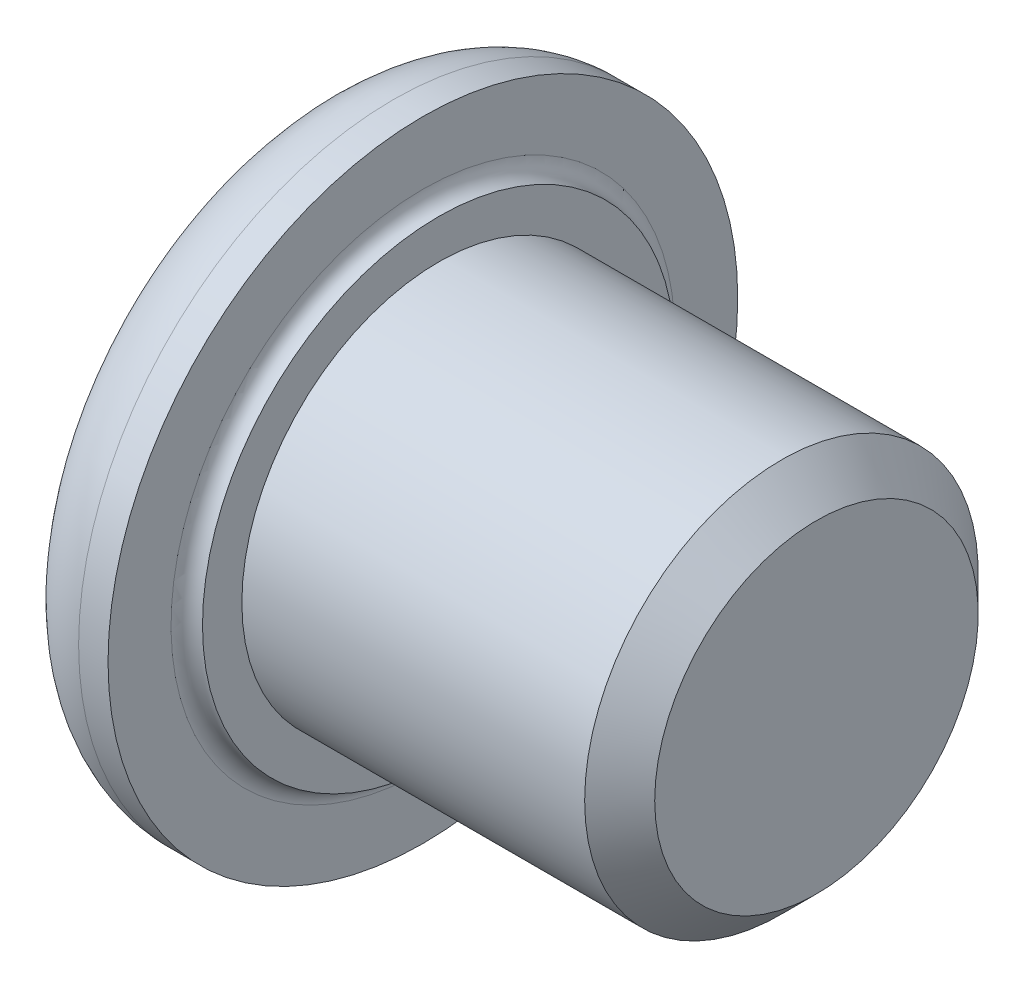
ISO-10303-21;
HEADER;
FILE_DESCRIPTION(('STEP AP214'),'2;1');
FILE_NAME('part.step','',(''),(''),'','','');
FILE_SCHEMA(('AUTOMOTIVE_DESIGN { 1 0 10303 214 1 1 1 1 }'));
ENDSEC;
DATA;
#1=APPLICATION_CONTEXT('core data for automotive mechanical design processes');
#2=APPLICATION_PROTOCOL_DEFINITION('international standard','automotive_design',2000,#1);
#3=PRODUCT_CONTEXT('',#1,'mechanical');
#4=PRODUCT('Part','Part','',(#3));
#5=PRODUCT_RELATED_PRODUCT_CATEGORY('part','',(#4));
#6=PRODUCT_DEFINITION_FORMATION('','',#4);
#7=PRODUCT_DEFINITION_CONTEXT('part definition',#1,'design');
#8=PRODUCT_DEFINITION('design','',#6,#7);
#9=PRODUCT_DEFINITION_SHAPE('','',#8);
#10=(LENGTH_UNIT() NAMED_UNIT(*) SI_UNIT(.MILLI.,.METRE.));
#11=(NAMED_UNIT(*) PLANE_ANGLE_UNIT() SI_UNIT($,.RADIAN.));
#12=(NAMED_UNIT(*) SI_UNIT($,.STERADIAN.) SOLID_ANGLE_UNIT());
#13=UNCERTAINTY_MEASURE_WITH_UNIT(LENGTH_MEASURE(1.E-05),#10,'distance_accuracy_value','');
#14=(GEOMETRIC_REPRESENTATION_CONTEXT(3) GLOBAL_UNCERTAINTY_ASSIGNED_CONTEXT((#13)) GLOBAL_UNIT_ASSIGNED_CONTEXT((#10,
#11,#12)) REPRESENTATION_CONTEXT('',''));
#15=CARTESIAN_POINT('',(0.,0.,0.));
#16=DIRECTION('',(0.,0.,1.));
#17=DIRECTION('',(1.,0.,0.));
#18=AXIS2_PLACEMENT_3D('',#15,#16,#17);
#19=CARTESIAN_POINT('',(1.5,0.,0.));
#20=DIRECTION('',(1.,0.,0.));
#21=DIRECTION('',(0.,1.,0.));
#22=AXIS2_PLACEMENT_3D('',#19,#20,#21);
#23=SPHERICAL_SURFACE('',#22,8.5);
#24=CARTESIAN_POINT('',(-6.29037868142493,0.,0.));
#25=DIRECTION('',(1.,0.,0.));
#26=DIRECTION('',(0.,1.,0.));
#27=AXIS2_PLACEMENT_3D('',#24,#25,#26);
#28=CIRCLE('',#27,3.4);
#29=CARTESIAN_POINT('',(-6.29037868142493,3.4,0.));
#30=VERTEX_POINT('',#29);
#31=EDGE_CURVE('E11',#30,#30,#28,.F.);
#32=ORIENTED_EDGE('',*,*,#31,.T.);
#33=EDGE_LOOP('',(#32));
#34=FACE_BOUND('',#33,.T.);
#35=CARTESIAN_POINT('',(1.5,0.649519052838329,1.125));
#36=DIRECTION('',(0.,0.5,0.866025403784439));
#37=DIRECTION('',(0.,-0.866025403784439,0.5));
#38=AXIS2_PLACEMENT_3D('',#35,#36,#37);
#39=CIRCLE('',#38,8.40014880820573);
#40=CARTESIAN_POINT('',(-6.86660026534076,0.,1.5));
#41=VERTEX_POINT('',#40);
#42=CARTESIAN_POINT('',(-6.86660026534076,1.29903810567666,0.75));
#43=VERTEX_POINT('',#42);
#44=EDGE_CURVE('E102',#41,#43,#39,.F.);
#45=ORIENTED_EDGE('',*,*,#44,.F.);
#46=CARTESIAN_POINT('',(1.5,-0.649519052838329,1.125));
#47=DIRECTION('',(0.,-0.5,0.866025403784439));
#48=DIRECTION('',(0.,-0.866025403784439,-0.5));
#49=AXIS2_PLACEMENT_3D('',#46,#47,#48);
#50=CIRCLE('',#49,8.40014880820573);
#51=CARTESIAN_POINT('',(-6.86660026534076,-1.29903810567666,0.75));
#52=VERTEX_POINT('',#51);
#53=EDGE_CURVE('E67',#52,#41,#50,.F.);
#54=ORIENTED_EDGE('',*,*,#53,.F.);
#55=CARTESIAN_POINT('',(1.5,-1.29903810567666,0.));
#56=DIRECTION('',(0.,-1.,0.));
#57=DIRECTION('',(0.,0.,-1.));
#58=AXIS2_PLACEMENT_3D('',#55,#56,#57);
#59=CIRCLE('',#58,8.40014880820573);
#60=CARTESIAN_POINT('',(-6.86660026534076,-1.29903810567666,-0.75));
#61=VERTEX_POINT('',#60);
#62=EDGE_CURVE('E170',#61,#52,#59,.F.);
#63=ORIENTED_EDGE('',*,*,#62,.F.);
#64=CARTESIAN_POINT('',(1.5,-0.649519052838329,-1.125));
#65=DIRECTION('',(0.,-0.5,-0.866025403784439));
#66=DIRECTION('',(0.,0.866025403784439,-0.5));
#67=AXIS2_PLACEMENT_3D('',#64,#65,#66);
#68=CIRCLE('',#67,8.40014880820573);
#69=CARTESIAN_POINT('',(-6.86660026534076,0.,-1.5));
#70=VERTEX_POINT('',#69);
#71=EDGE_CURVE('E167',#70,#61,#68,.F.);
#72=ORIENTED_EDGE('',*,*,#71,.F.);
#73=CARTESIAN_POINT('',(1.5,0.649519052838329,-1.125));
#74=DIRECTION('',(0.,0.5,-0.866025403784439));
#75=DIRECTION('',(0.,0.866025403784439,0.5));
#76=AXIS2_PLACEMENT_3D('',#73,#74,#75);
#77=CIRCLE('',#76,8.40014880820573);
#78=CARTESIAN_POINT('',(-6.86660026534076,1.29903810567666,-0.75));
#79=VERTEX_POINT('',#78);
#80=EDGE_CURVE('E164',#79,#70,#77,.F.);
#81=ORIENTED_EDGE('',*,*,#80,.F.);
#82=CARTESIAN_POINT('',(1.5,1.29903810567666,0.));
#83=DIRECTION('',(0.,1.,0.));
#84=DIRECTION('',(0.,0.,1.));
#85=AXIS2_PLACEMENT_3D('',#82,#83,#84);
#86=CIRCLE('',#85,8.40014880820573);
#87=EDGE_CURVE('E161',#43,#79,#86,.F.);
#88=ORIENTED_EDGE('',*,*,#87,.F.);
#89=EDGE_LOOP('',(#45,#54,#63,#72,#81,#88));
#90=FACE_BOUND('',#89,.T.);
#91=ADVANCED_FACE('F43',(#34,#90),#23,.T.);
#92=CARTESIAN_POINT('',(0.,0.,0.));
#93=DIRECTION('',(1.,0.,0.));
#94=DIRECTION('',(0.,1.,0.));
#95=AXIS2_PLACEMENT_3D('',#92,#93,#94);
#96=CYLINDRICAL_SURFACE('',#95,4.);
#97=CARTESIAN_POINT('',(-5.37386354243376,0.,0.));
#98=DIRECTION('',(1.,0.,0.));
#99=DIRECTION('',(0.,1.,0.));
#100=AXIS2_PLACEMENT_3D('',#97,#98,#99);
#101=CIRCLE('',#100,4.);
#102=CARTESIAN_POINT('',(-5.37386354243376,4.,0.));
#103=VERTEX_POINT('',#102);
#104=EDGE_CURVE('E52',#103,#103,#101,.T.);
#105=ORIENTED_EDGE('',*,*,#104,.T.);
#106=EDGE_LOOP('',(#105));
#107=FACE_BOUND('',#106,.T.);
#108=CARTESIAN_POINT('',(-5.,0.,0.));
#109=DIRECTION('',(1.,0.,0.));
#110=DIRECTION('',(0.,1.,0.));
#111=AXIS2_PLACEMENT_3D('',#108,#109,#110);
#112=CIRCLE('',#111,4.);
#113=CARTESIAN_POINT('',(-5.,4.,0.));
#114=VERTEX_POINT('',#113);
#115=EDGE_CURVE('E144',#114,#114,#112,.T.);
#116=ORIENTED_EDGE('',*,*,#115,.F.);
#117=EDGE_LOOP('',(#116));
#118=FACE_BOUND('',#117,.T.);
#119=ADVANCED_FACE('F184',(#107,#118),#96,.T.);
#120=CARTESIAN_POINT('',(-5.,4.,0.));
#121=DIRECTION('',(1.,0.,0.));
#122=DIRECTION('',(0.,1.,0.));
#123=AXIS2_PLACEMENT_3D('',#120,#121,#122);
#124=PLANE('',#123);
#125=CARTESIAN_POINT('',(-5.,0.,0.));
#126=DIRECTION('',(1.,0.,0.));
#127=DIRECTION('',(0.,1.,0.));
#128=AXIS2_PLACEMENT_3D('',#125,#126,#127);
#129=CIRCLE('',#128,3.2);
#130=CARTESIAN_POINT('',(-5.,3.2,0.));
#131=VERTEX_POINT('',#130);
#132=EDGE_CURVE('E177',#131,#131,#129,.F.);
#133=ORIENTED_EDGE('',*,*,#132,.T.);
#134=EDGE_LOOP('',(#133));
#135=FACE_BOUND('',#134,.T.);
#136=ORIENTED_EDGE('',*,*,#115,.T.);
#137=EDGE_LOOP('',(#136));
#138=FACE_BOUND('',#137,.T.);
#139=ADVANCED_FACE('F206',(#135,#138),#124,.T.);
#140=CARTESIAN_POINT('',(-6.5,0.,1.5));
#141=DIRECTION('',(0.,0.5,0.866025403784439));
#142=DIRECTION('',(0.,-0.866025403784439,0.5));
#143=AXIS2_PLACEMENT_3D('',#140,#141,#142);
#144=PLANE('',#143);
#145=ORIENTED_EDGE('',*,*,#44,.T.);
#146=DIRECTION('',(-1.,0.,0.));
#147=VECTOR('',#146,1.);
#148=CARTESIAN_POINT('',(-6.5,1.29903810567666,0.75));
#149=LINE('',#148,#147);
#150=CARTESIAN_POINT('',(-6.5,1.29903810567666,0.75));
#151=VERTEX_POINT('',#150);
#152=EDGE_CURVE('E59',#151,#43,#149,.T.);
#153=ORIENTED_EDGE('',*,*,#152,.F.);
#154=DIRECTION('',(0.,0.866025403784439,-0.5));
#155=VECTOR('',#154,1.);
#156=CARTESIAN_POINT('',(-6.5,0.,1.5));
#157=LINE('',#156,#155);
#158=CARTESIAN_POINT('',(-6.5,0.,1.5));
#159=VERTEX_POINT('',#158);
#160=EDGE_CURVE('E99',#159,#151,#157,.T.);
#161=ORIENTED_EDGE('',*,*,#160,.F.);
#162=DIRECTION('',(-1.,0.,0.));
#163=VECTOR('',#162,1.);
#164=CARTESIAN_POINT('',(-6.5,0.,1.5));
#165=LINE('',#164,#163);
#166=EDGE_CURVE('E141',#159,#41,#165,.T.);
#167=ORIENTED_EDGE('',*,*,#166,.T.);
#168=EDGE_LOOP('',(#145,#153,#161,#167));
#169=FACE_BOUND('',#168,.T.);
#170=ADVANCED_FACE('F97',(#169),#144,.F.);
#171=CARTESIAN_POINT('',(-6.5,-1.29903810567666,0.75));
#172=DIRECTION('',(0.,-0.5,0.866025403784439));
#173=DIRECTION('',(0.,-0.866025403784439,-0.5));
#174=AXIS2_PLACEMENT_3D('',#171,#172,#173);
#175=PLANE('',#174);
#176=ORIENTED_EDGE('',*,*,#53,.T.);
#177=ORIENTED_EDGE('',*,*,#166,.F.);
#178=DIRECTION('',(0.,0.866025403784439,0.5));
#179=VECTOR('',#178,1.);
#180=CARTESIAN_POINT('',(-6.5,-1.29903810567666,0.75));
#181=LINE('',#180,#179);
#182=CARTESIAN_POINT('',(-6.5,-1.29903810567666,0.75));
#183=VERTEX_POINT('',#182);
#184=EDGE_CURVE('E106',#183,#159,#181,.T.);
#185=ORIENTED_EDGE('',*,*,#184,.F.);
#186=DIRECTION('',(-1.,0.,0.));
#187=VECTOR('',#186,1.);
#188=CARTESIAN_POINT('',(-6.5,-1.29903810567666,0.75));
#189=LINE('',#188,#187);
#190=EDGE_CURVE('E145',#183,#52,#189,.T.);
#191=ORIENTED_EDGE('',*,*,#190,.T.);
#192=EDGE_LOOP('',(#176,#177,#185,#191));
#193=FACE_BOUND('',#192,.T.);
#194=ADVANCED_FACE('F246',(#193),#175,.F.);
#195=CARTESIAN_POINT('',(-6.5,-1.29903810567666,-0.75));
#196=DIRECTION('',(0.,-1.,0.));
#197=DIRECTION('',(0.,0.,-1.));
#198=AXIS2_PLACEMENT_3D('',#195,#196,#197);
#199=PLANE('',#198);
#200=ORIENTED_EDGE('',*,*,#62,.T.);
#201=ORIENTED_EDGE('',*,*,#190,.F.);
#202=DIRECTION('',(0.,0.,1.));
#203=VECTOR('',#202,1.);
#204=CARTESIAN_POINT('',(-6.5,-1.29903810567666,-0.75));
#205=LINE('',#204,#203);
#206=CARTESIAN_POINT('',(-6.5,-1.29903810567666,-0.75));
#207=VERTEX_POINT('',#206);
#208=EDGE_CURVE('E136',#207,#183,#205,.T.);
#209=ORIENTED_EDGE('',*,*,#208,.F.);
#210=DIRECTION('',(-1.,0.,0.));
#211=VECTOR('',#210,1.);
#212=CARTESIAN_POINT('',(-6.5,-1.29903810567666,-0.75));
#213=LINE('',#212,#211);
#214=EDGE_CURVE('E148',#207,#61,#213,.T.);
#215=ORIENTED_EDGE('',*,*,#214,.T.);
#216=EDGE_LOOP('',(#200,#201,#209,#215));
#217=FACE_BOUND('',#216,.T.);
#218=ADVANCED_FACE('F249',(#217),#199,.F.);
#219=CARTESIAN_POINT('',(-6.5,0.,-1.5));
#220=DIRECTION('',(0.,-0.5,-0.866025403784439));
#221=DIRECTION('',(0.,0.866025403784439,-0.5));
#222=AXIS2_PLACEMENT_3D('',#219,#220,#221);
#223=PLANE('',#222);
#224=ORIENTED_EDGE('',*,*,#71,.T.);
#225=ORIENTED_EDGE('',*,*,#214,.F.);
#226=DIRECTION('',(0.,-0.866025403784439,0.5));
#227=VECTOR('',#226,1.);
#228=CARTESIAN_POINT('',(-6.5,0.,-1.5));
#229=LINE('',#228,#227);
#230=CARTESIAN_POINT('',(-6.5,0.,-1.5));
#231=VERTEX_POINT('',#230);
#232=EDGE_CURVE('E132',#231,#207,#229,.T.);
#233=ORIENTED_EDGE('',*,*,#232,.F.);
#234=DIRECTION('',(-1.,0.,0.));
#235=VECTOR('',#234,1.);
#236=CARTESIAN_POINT('',(-6.5,0.,-1.5));
#237=LINE('',#236,#235);
#238=EDGE_CURVE('E152',#231,#70,#237,.T.);
#239=ORIENTED_EDGE('',*,*,#238,.T.);
#240=EDGE_LOOP('',(#224,#225,#233,#239));
#241=FACE_BOUND('',#240,.T.);
#242=ADVANCED_FACE('F252',(#241),#223,.F.);
#243=CARTESIAN_POINT('',(-6.5,1.29903810567666,-0.75));
#244=DIRECTION('',(0.,0.5,-0.866025403784439));
#245=DIRECTION('',(0.,0.866025403784439,0.5));
#246=AXIS2_PLACEMENT_3D('',#243,#244,#245);
#247=PLANE('',#246);
#248=ORIENTED_EDGE('',*,*,#80,.T.);
#249=ORIENTED_EDGE('',*,*,#238,.F.);
#250=DIRECTION('',(0.,-0.866025403784439,-0.5));
#251=VECTOR('',#250,1.);
#252=CARTESIAN_POINT('',(-6.5,1.29903810567666,-0.75));
#253=LINE('',#252,#251);
#254=CARTESIAN_POINT('',(-6.5,1.29903810567666,-0.75));
#255=VERTEX_POINT('',#254);
#256=EDGE_CURVE('E116',#255,#231,#253,.T.);
#257=ORIENTED_EDGE('',*,*,#256,.F.);
#258=DIRECTION('',(-1.,0.,0.));
#259=VECTOR('',#258,1.);
#260=CARTESIAN_POINT('',(-6.5,1.29903810567666,-0.75));
#261=LINE('',#260,#259);
#262=EDGE_CURVE('E105',#255,#79,#261,.T.);
#263=ORIENTED_EDGE('',*,*,#262,.T.);
#264=EDGE_LOOP('',(#248,#249,#257,#263));
#265=FACE_BOUND('',#264,.T.);
#266=ADVANCED_FACE('F256',(#265),#247,.F.);
#267=CARTESIAN_POINT('',(-6.5,1.29903810567666,0.75));
#268=DIRECTION('',(0.,1.,0.));
#269=DIRECTION('',(0.,0.,1.));
#270=AXIS2_PLACEMENT_3D('',#267,#268,#269);
#271=PLANE('',#270);
#272=ORIENTED_EDGE('',*,*,#87,.T.);
#273=ORIENTED_EDGE('',*,*,#262,.F.);
#274=DIRECTION('',(0.,0.,-1.));
#275=VECTOR('',#274,1.);
#276=CARTESIAN_POINT('',(-6.5,1.29903810567666,0.75));
#277=LINE('',#276,#275);
#278=EDGE_CURVE('E109',#151,#255,#277,.T.);
#279=ORIENTED_EDGE('',*,*,#278,.F.);
#280=ORIENTED_EDGE('',*,*,#152,.T.);
#281=EDGE_LOOP('',(#272,#273,#279,#280));
#282=FACE_BOUND('',#281,.T.);
#283=ADVANCED_FACE('F110',(#282),#271,.F.);
#284=CARTESIAN_POINT('',(-6.5,0.,0.));
#285=DIRECTION('',(-1.,0.,0.));
#286=DIRECTION('',(0.,0.,1.));
#287=AXIS2_PLACEMENT_3D('',#284,#285,#286);
#288=PLANE('',#287);
#289=ORIENTED_EDGE('',*,*,#160,.T.);
#290=ORIENTED_EDGE('',*,*,#278,.T.);
#291=ORIENTED_EDGE('',*,*,#256,.T.);
#292=ORIENTED_EDGE('',*,*,#232,.T.);
#293=ORIENTED_EDGE('',*,*,#208,.T.);
#294=ORIENTED_EDGE('',*,*,#184,.T.);
#295=EDGE_LOOP('',(#289,#290,#291,#292,#293,#294));
#296=FACE_BOUND('',#295,.T.);
#297=ADVANCED_FACE('F118',(#296),#288,.T.);
#298=CARTESIAN_POINT('',(-4.8,0.,0.));
#299=DIRECTION('',(1.,0.,0.));
#300=DIRECTION('',(0.,1.,0.));
#301=AXIS2_PLACEMENT_3D('',#298,#299,#300);
#302=TOROIDAL_SURFACE('',#301,3.2,0.2);
#303=ORIENTED_EDGE('',*,*,#132,.F.);
#304=EDGE_LOOP('',(#303));
#305=FACE_BOUND('',#304,.T.);
#306=CARTESIAN_POINT('',(-4.8,0.,0.));
#307=DIRECTION('',(-1.,0.,0.));
#308=DIRECTION('',(0.,0.,1.));
#309=AXIS2_PLACEMENT_3D('',#306,#307,#308);
#310=CIRCLE('',#309,3.);
#311=CARTESIAN_POINT('',(-4.8,0.,3.));
#312=VERTEX_POINT('',#311);
#313=EDGE_CURVE('E126',#312,#312,#310,.T.);
#314=ORIENTED_EDGE('',*,*,#313,.T.);
#315=EDGE_LOOP('',(#314));
#316=FACE_BOUND('',#315,.T.);
#317=ADVANCED_FACE('F189',(#305,#316),#302,.F.);
#318=CARTESIAN_POINT('',(-5.37386354243376,0.,0.));
#319=DIRECTION('',(1.,0.,0.));
#320=DIRECTION('',(0.,1.,0.));
#321=AXIS2_PLACEMENT_3D('',#318,#319,#320);
#322=TOROIDAL_SURFACE('',#321,3.,1.);
#323=ORIENTED_EDGE('',*,*,#31,.F.);
#324=EDGE_LOOP('',(#323));
#325=FACE_BOUND('',#324,.T.);
#326=ORIENTED_EDGE('',*,*,#104,.F.);
#327=EDGE_LOOP('',(#326));
#328=FACE_BOUND('',#327,.T.);
#329=ADVANCED_FACE('F45',(#325,#328),#322,.T.);
#330=CARTESIAN_POINT('',(0.,0.,0.));
#331=DIRECTION('',(-1.,0.,0.));
#332=DIRECTION('',(0.,0.,1.));
#333=AXIS2_PLACEMENT_3D('',#330,#331,#332);
#334=CYLINDRICAL_SURFACE('',#333,2.5);
#335=CARTESIAN_POINT('',(-4.8,0.,0.));
#336=DIRECTION('',(-1.,0.,0.));
#337=DIRECTION('',(0.,0.,1.));
#338=AXIS2_PLACEMENT_3D('',#335,#336,#337);
#339=CIRCLE('',#338,2.5);
#340=CARTESIAN_POINT('',(-4.8,0.,2.5));
#341=VERTEX_POINT('',#340);
#342=EDGE_CURVE('E122',#341,#341,#339,.T.);
#343=ORIENTED_EDGE('',*,*,#342,.F.);
#344=EDGE_LOOP('',(#343));
#345=FACE_BOUND('',#344,.T.);
#346=CARTESIAN_POINT('',(-0.444999999999999,0.,0.));
#347=DIRECTION('',(-1.,0.,0.));
#348=DIRECTION('',(0.,0.,1.));
#349=AXIS2_PLACEMENT_3D('',#346,#347,#348);
#350=CIRCLE('',#349,2.5);
#351=CARTESIAN_POINT('',(-0.444999999999999,0.,2.5));
#352=VERTEX_POINT('',#351);
#353=EDGE_CURVE('E225',#352,#352,#350,.T.);
#354=ORIENTED_EDGE('',*,*,#353,.T.);
#355=EDGE_LOOP('',(#354));
#356=FACE_BOUND('',#355,.T.);
#357=ADVANCED_FACE('F188',(#345,#356),#334,.T.);
#358=CARTESIAN_POINT('',(-4.8,2.5,0.));
#359=DIRECTION('',(-1.,0.,0.));
#360=DIRECTION('',(0.,0.,1.));
#361=AXIS2_PLACEMENT_3D('',#358,#359,#360);
#362=PLANE('',#361);
#363=ORIENTED_EDGE('',*,*,#313,.F.);
#364=EDGE_LOOP('',(#363));
#365=FACE_BOUND('',#364,.T.);
#366=ORIENTED_EDGE('',*,*,#342,.T.);
#367=EDGE_LOOP('',(#366));
#368=FACE_BOUND('',#367,.T.);
#369=ADVANCED_FACE('F195',(#365,#368),#362,.F.);
#370=CARTESIAN_POINT('',(0.,0.,0.));
#371=DIRECTION('',(-1.,0.,0.));
#372=DIRECTION('',(0.,0.,1.));
#373=AXIS2_PLACEMENT_3D('',#370,#371,#372);
#374=CONICAL_SURFACE('',#373,2.055,0.785398163397449);
#375=ORIENTED_EDGE('',*,*,#353,.F.);
#376=EDGE_LOOP('',(#375));
#377=FACE_BOUND('',#376,.T.);
#378=CARTESIAN_POINT('',(0.,0.,0.));
#379=DIRECTION('',(-1.,0.,0.));
#380=DIRECTION('',(0.,0.,1.));
#381=AXIS2_PLACEMENT_3D('',#378,#379,#380);
#382=CIRCLE('',#381,2.055);
#383=CARTESIAN_POINT('',(0.,0.,2.055));
#384=VERTEX_POINT('',#383);
#385=EDGE_CURVE('E222',#384,#384,#382,.T.);
#386=ORIENTED_EDGE('',*,*,#385,.T.);
#387=EDGE_LOOP('',(#386));
#388=FACE_BOUND('',#387,.T.);
#389=ADVANCED_FACE('F213',(#377,#388),#374,.T.);
#390=CARTESIAN_POINT('',(0.,3.,0.));
#391=DIRECTION('',(1.,0.,0.));
#392=DIRECTION('',(0.,1.,0.));
#393=AXIS2_PLACEMENT_3D('',#390,#391,#392);
#394=PLANE('',#393);
#395=ORIENTED_EDGE('',*,*,#385,.F.);
#396=EDGE_LOOP('',(#395));
#397=FACE_BOUND('',#396,.T.);
#398=ADVANCED_FACE('F211',(#397),#394,.T.);
#399=CLOSED_SHELL('',(#91,#119,#139,#170,#194,#218,#242,#266,#283,#297,#317,#329,#357,#369,#389,#398));
#400=MANIFOLD_SOLID_BREP('B2',#399);
#401=ADVANCED_BREP_SHAPE_REPRESENTATION('',(#18,#400),#14);
#402=SHAPE_DEFINITION_REPRESENTATION(#9,#401);
ENDSEC;
END-ISO-10303-21;
